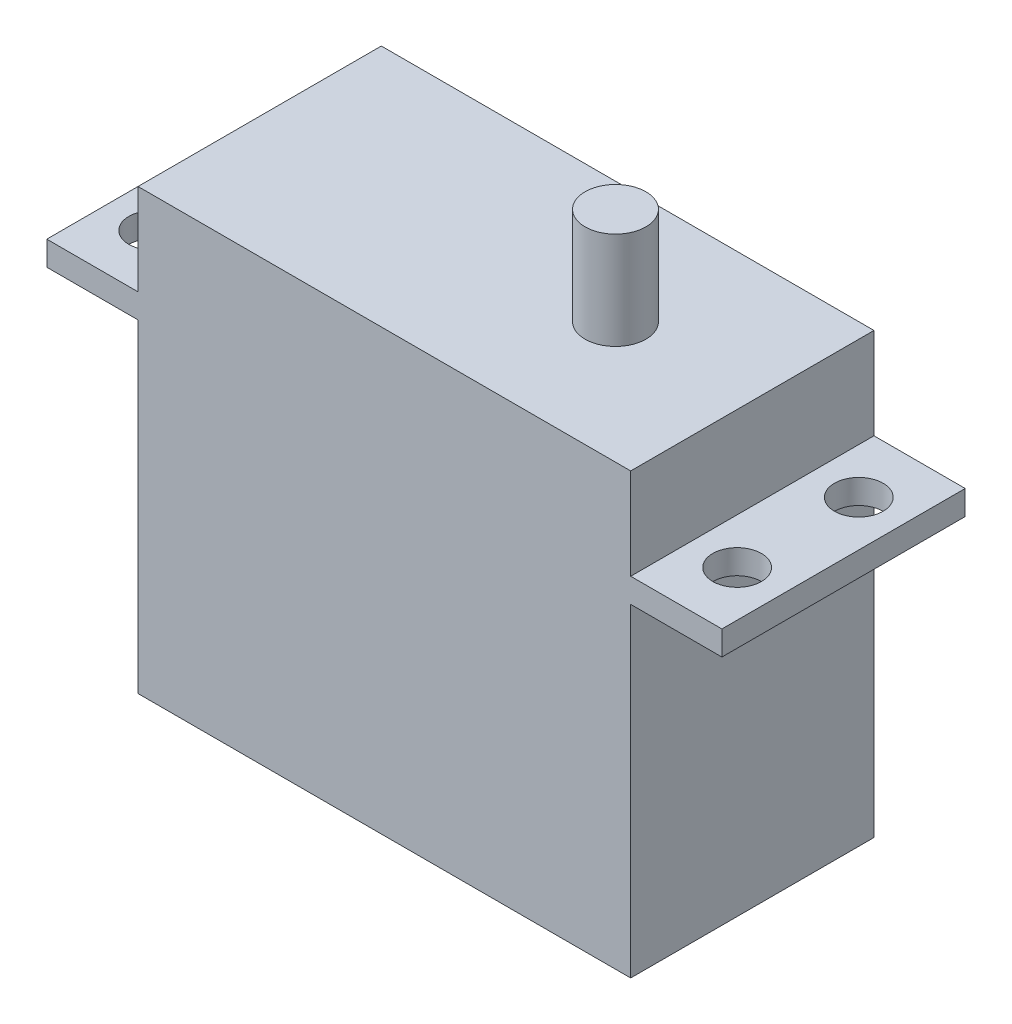
ISO-10303-21;
HEADER;
FILE_DESCRIPTION(('STEP AP214'),'2;1');
FILE_NAME('part.step','',(''),(''),'','','');
FILE_SCHEMA(('AUTOMOTIVE_DESIGN { 1 0 10303 214 1 1 1 1 }'));
ENDSEC;
DATA;
#1=APPLICATION_CONTEXT('core data for automotive mechanical design processes');
#2=APPLICATION_PROTOCOL_DEFINITION('international standard','automotive_design',2000,#1);
#3=PRODUCT_CONTEXT('',#1,'mechanical');
#4=PRODUCT('Part','Part','',(#3));
#5=PRODUCT_RELATED_PRODUCT_CATEGORY('part','',(#4));
#6=PRODUCT_DEFINITION_FORMATION('','',#4);
#7=PRODUCT_DEFINITION_CONTEXT('part definition',#1,'design');
#8=PRODUCT_DEFINITION('design','',#6,#7);
#9=PRODUCT_DEFINITION_SHAPE('','',#8);
#10=(LENGTH_UNIT() NAMED_UNIT(*) SI_UNIT(.MILLI.,.METRE.));
#11=(NAMED_UNIT(*) PLANE_ANGLE_UNIT() SI_UNIT($,.RADIAN.));
#12=(NAMED_UNIT(*) SI_UNIT($,.STERADIAN.) SOLID_ANGLE_UNIT());
#13=UNCERTAINTY_MEASURE_WITH_UNIT(LENGTH_MEASURE(1.E-05),#10,'distance_accuracy_value','');
#14=(GEOMETRIC_REPRESENTATION_CONTEXT(3) GLOBAL_UNCERTAINTY_ASSIGNED_CONTEXT((#13)) GLOBAL_UNIT_ASSIGNED_CONTEXT((#10,
#11,#12)) REPRESENTATION_CONTEXT('',''));
#15=CARTESIAN_POINT('',(0.,0.,0.));
#16=DIRECTION('',(0.,0.,1.));
#17=DIRECTION('',(1.,0.,0.));
#18=AXIS2_PLACEMENT_3D('',#15,#16,#17);
#19=CARTESIAN_POINT('',(-16.7432620080768,36.1,-10.7539016762014));
#20=DIRECTION('',(1.,0.,0.));
#21=DIRECTION('',(0.,0.,-1.));
#22=AXIS2_PLACEMENT_3D('',#19,#20,#21);
#23=PLANE('',#22);
#24=DIRECTION('',(0.,-1.,0.));
#25=VECTOR('',#24,1.);
#26=CARTESIAN_POINT('',(-16.7432620080768,36.1,-10.7539016762014));
#27=LINE('',#26,#25);
#28=CARTESIAN_POINT('',(-16.7432620080768,36.1,-10.7539016762014));
#29=VERTEX_POINT('',#28);
#30=CARTESIAN_POINT('',(-16.7432620080768,28.6,-10.7539016762014));
#31=VERTEX_POINT('',#30);
#32=EDGE_CURVE('E210',#29,#31,#27,.T.);
#33=ORIENTED_EDGE('',*,*,#32,.T.);
#34=DIRECTION('',(0.,0.,1.));
#35=VECTOR('',#34,1.);
#36=CARTESIAN_POINT('',(-16.7432620080768,28.6,-10.7539016762014));
#37=LINE('',#36,#35);
#38=CARTESIAN_POINT('',(-16.7432620080768,28.6,9.24609832379855));
#39=VERTEX_POINT('',#38);
#40=EDGE_CURVE('E181',#31,#39,#37,.T.);
#41=ORIENTED_EDGE('',*,*,#40,.T.);
#42=DIRECTION('',(0.,-1.,0.));
#43=VECTOR('',#42,1.);
#44=CARTESIAN_POINT('',(-16.7432620080768,36.1,9.24609832379855));
#45=LINE('',#44,#43);
#46=CARTESIAN_POINT('',(-16.7432620080768,36.1,9.24609832379855));
#47=VERTEX_POINT('',#46);
#48=EDGE_CURVE('E11',#47,#39,#45,.T.);
#49=ORIENTED_EDGE('',*,*,#48,.F.);
#50=DIRECTION('',(0.,0.,1.));
#51=VECTOR('',#50,1.);
#52=CARTESIAN_POINT('',(-16.7432620080768,36.1,-10.7539016762014));
#53=LINE('',#52,#51);
#54=EDGE_CURVE('E191',#29,#47,#53,.T.);
#55=ORIENTED_EDGE('',*,*,#54,.F.);
#56=EDGE_LOOP('',(#33,#41,#49,#55));
#57=FACE_BOUND('',#56,.T.);
#58=ADVANCED_FACE('F32',(#57),#23,.F.);
#59=CARTESIAN_POINT('',(23.7567379919232,36.1,-10.7539016762014));
#60=DIRECTION('',(-1.,0.,0.));
#61=DIRECTION('',(0.,0.,1.));
#62=AXIS2_PLACEMENT_3D('',#59,#60,#61);
#63=PLANE('',#62);
#64=DIRECTION('',(0.,-1.,0.));
#65=VECTOR('',#64,1.);
#66=CARTESIAN_POINT('',(23.7567379919232,36.1,9.24609832379855));
#67=LINE('',#66,#65);
#68=CARTESIAN_POINT('',(23.7567379919232,36.1,9.24609832379855));
#69=VERTEX_POINT('',#68);
#70=CARTESIAN_POINT('',(23.7567379919232,28.6,9.24609832379855));
#71=VERTEX_POINT('',#70);
#72=EDGE_CURVE('E218',#69,#71,#67,.T.);
#73=ORIENTED_EDGE('',*,*,#72,.T.);
#74=DIRECTION('',(0.,0.,-1.));
#75=VECTOR('',#74,1.);
#76=CARTESIAN_POINT('',(23.7567379919232,28.6,-10.7539016762014));
#77=LINE('',#76,#75);
#78=CARTESIAN_POINT('',(23.7567379919232,28.6,-10.7539016762015));
#79=VERTEX_POINT('',#78);
#80=EDGE_CURVE('E178',#71,#79,#77,.T.);
#81=ORIENTED_EDGE('',*,*,#80,.T.);
#82=DIRECTION('',(0.,-1.,0.));
#83=VECTOR('',#82,1.);
#84=CARTESIAN_POINT('',(23.7567379919232,36.1,-10.7539016762014));
#85=LINE('',#84,#83);
#86=CARTESIAN_POINT('',(23.7567379919232,36.1,-10.7539016762014));
#87=VERTEX_POINT('',#86);
#88=EDGE_CURVE('E214',#87,#79,#85,.T.);
#89=ORIENTED_EDGE('',*,*,#88,.F.);
#90=DIRECTION('',(0.,0.,-1.));
#91=VECTOR('',#90,1.);
#92=CARTESIAN_POINT('',(23.7567379919232,36.1,-10.7539016762014));
#93=LINE('',#92,#91);
#94=EDGE_CURVE('E197',#69,#87,#93,.T.);
#95=ORIENTED_EDGE('',*,*,#94,.F.);
#96=EDGE_LOOP('',(#73,#81,#89,#95));
#97=FACE_BOUND('',#96,.T.);
#98=ADVANCED_FACE('F246',(#97),#63,.F.);
#99=CARTESIAN_POINT('',(-16.7432620080768,26.6,9.24609832379855));
#100=VERTEX_POINT('',#99);
#101=CARTESIAN_POINT('',(-16.7432620080768,0.,9.24609832379855));
#102=VERTEX_POINT('',#101);
#103=EDGE_CURVE('E41',#100,#102,#45,.T.);
#104=ORIENTED_EDGE('',*,*,#103,.F.);
#105=DIRECTION('',(0.,0.,-1.));
#106=VECTOR('',#105,1.);
#107=CARTESIAN_POINT('',(-16.7432620080768,26.6,-10.7539016762014));
#108=LINE('',#107,#106);
#109=CARTESIAN_POINT('',(-16.7432620080768,26.6,-10.7539016762014));
#110=VERTEX_POINT('',#109);
#111=EDGE_CURVE('E176',#100,#110,#108,.T.);
#112=ORIENTED_EDGE('',*,*,#111,.T.);
#113=CARTESIAN_POINT('',(-16.7432620080768,0.,-10.7539016762014));
#114=VERTEX_POINT('',#113);
#115=EDGE_CURVE('E128',#110,#114,#27,.T.);
#116=ORIENTED_EDGE('',*,*,#115,.T.);
#117=DIRECTION('',(0.,0.,1.));
#118=VECTOR('',#117,1.);
#119=CARTESIAN_POINT('',(-16.7432620080768,0.,-10.7539016762014));
#120=LINE('',#119,#118);
#121=EDGE_CURVE('E188',#114,#102,#120,.T.);
#122=ORIENTED_EDGE('',*,*,#121,.T.);
#123=EDGE_LOOP('',(#104,#112,#116,#122));
#124=FACE_BOUND('',#123,.T.);
#125=ADVANCED_FACE('F34',(#124),#23,.F.);
#126=CARTESIAN_POINT('',(-16.7432620080768,36.1,9.24609832379855));
#127=DIRECTION('',(0.,0.,-1.));
#128=DIRECTION('',(-1.,0.,0.));
#129=AXIS2_PLACEMENT_3D('',#126,#127,#128);
#130=PLANE('',#129);
#131=CARTESIAN_POINT('',(23.7567379919232,26.6,9.24609832379855));
#132=VERTEX_POINT('',#131);
#133=CARTESIAN_POINT('',(23.7567379919232,0.,9.24609832379855));
#134=VERTEX_POINT('',#133);
#135=EDGE_CURVE('E217',#132,#134,#67,.T.);
#136=ORIENTED_EDGE('',*,*,#135,.F.);
#137=DIRECTION('',(-1.,0.,0.));
#138=VECTOR('',#137,1.);
#139=CARTESIAN_POINT('',(31.2567379919232,26.6,9.24609832379855));
#140=LINE('',#139,#138);
#141=CARTESIAN_POINT('',(31.2567379919232,26.6,9.24609832379855));
#142=VERTEX_POINT('',#141);
#143=EDGE_CURVE('E49',#142,#132,#140,.T.);
#144=ORIENTED_EDGE('',*,*,#143,.F.);
#145=DIRECTION('',(0.,1.,0.));
#146=VECTOR('',#145,1.);
#147=CARTESIAN_POINT('',(31.2567379919232,28.6,9.24609832379855));
#148=LINE('',#147,#146);
#149=CARTESIAN_POINT('',(31.2567379919232,28.6,9.24609832379855));
#150=VERTEX_POINT('',#149);
#151=EDGE_CURVE('E160',#142,#150,#148,.T.);
#152=ORIENTED_EDGE('',*,*,#151,.T.);
#153=DIRECTION('',(-1.,0.,0.));
#154=VECTOR('',#153,1.);
#155=CARTESIAN_POINT('',(31.2567379919232,28.6,9.24609832379855));
#156=LINE('',#155,#154);
#157=EDGE_CURVE('E169',#150,#71,#156,.T.);
#158=ORIENTED_EDGE('',*,*,#157,.T.);
#159=ORIENTED_EDGE('',*,*,#72,.F.);
#160=DIRECTION('',(1.,0.,0.));
#161=VECTOR('',#160,1.);
#162=CARTESIAN_POINT('',(-16.7432620080768,36.1,9.24609832379855));
#163=LINE('',#162,#161);
#164=EDGE_CURVE('E194',#47,#69,#163,.T.);
#165=ORIENTED_EDGE('',*,*,#164,.F.);
#166=ORIENTED_EDGE('',*,*,#48,.T.);
#167=CARTESIAN_POINT('',(-24.2432620080768,28.6,9.24609832379856));
#168=VERTEX_POINT('',#167);
#169=EDGE_CURVE('E172',#39,#168,#156,.T.);
#170=ORIENTED_EDGE('',*,*,#169,.T.);
#171=DIRECTION('',(0.,1.,0.));
#172=VECTOR('',#171,1.);
#173=CARTESIAN_POINT('',(-24.2432620080768,28.6,9.24609832379856));
#174=LINE('',#173,#172);
#175=CARTESIAN_POINT('',(-24.2432620080768,26.6,9.24609832379856));
#176=VERTEX_POINT('',#175);
#177=EDGE_CURVE('E140',#176,#168,#174,.T.);
#178=ORIENTED_EDGE('',*,*,#177,.F.);
#179=EDGE_CURVE('E136',#100,#176,#140,.T.);
#180=ORIENTED_EDGE('',*,*,#179,.F.);
#181=ORIENTED_EDGE('',*,*,#103,.T.);
#182=DIRECTION('',(1.,0.,0.));
#183=VECTOR('',#182,1.);
#184=CARTESIAN_POINT('',(-16.7432620080768,0.,9.24609832379855));
#185=LINE('',#184,#183);
#186=EDGE_CURVE('E203',#102,#134,#185,.T.);
#187=ORIENTED_EDGE('',*,*,#186,.T.);
#188=EDGE_LOOP('',(#136,#144,#152,#158,#159,#165,#166,#170,#178,#180,#181,#187));
#189=FACE_BOUND('',#188,.T.);
#190=ADVANCED_FACE('F231',(#189),#130,.F.);
#191=CARTESIAN_POINT('',(23.7567379919232,26.6,-10.7539016762015));
#192=VERTEX_POINT('',#191);
#193=CARTESIAN_POINT('',(23.7567379919232,0.,-10.7539016762014));
#194=VERTEX_POINT('',#193);
#195=EDGE_CURVE('E213',#192,#194,#85,.T.);
#196=ORIENTED_EDGE('',*,*,#195,.F.);
#197=DIRECTION('',(0.,0.,1.));
#198=VECTOR('',#197,1.);
#199=CARTESIAN_POINT('',(23.7567379919232,26.6,-10.7539016762014));
#200=LINE('',#199,#198);
#201=EDGE_CURVE('E167',#192,#132,#200,.T.);
#202=ORIENTED_EDGE('',*,*,#201,.T.);
#203=ORIENTED_EDGE('',*,*,#135,.T.);
#204=DIRECTION('',(0.,0.,-1.));
#205=VECTOR('',#204,1.);
#206=CARTESIAN_POINT('',(23.7567379919232,0.,-10.7539016762014));
#207=LINE('',#206,#205);
#208=EDGE_CURVE('E206',#134,#194,#207,.T.);
#209=ORIENTED_EDGE('',*,*,#208,.T.);
#210=EDGE_LOOP('',(#196,#202,#203,#209));
#211=FACE_BOUND('',#210,.T.);
#212=ADVANCED_FACE('F226',(#211),#63,.F.);
#213=CARTESIAN_POINT('',(-16.7432620080768,36.1,-10.7539016762014));
#214=DIRECTION('',(0.,0.,1.));
#215=DIRECTION('',(1.,0.,0.));
#216=AXIS2_PLACEMENT_3D('',#213,#214,#215);
#217=PLANE('',#216);
#218=ORIENTED_EDGE('',*,*,#115,.F.);
#219=DIRECTION('',(-1.,0.,0.));
#220=VECTOR('',#219,1.);
#221=CARTESIAN_POINT('',(31.2567379919232,26.6,-10.7539016762015));
#222=LINE('',#221,#220);
#223=CARTESIAN_POINT('',(-24.2432620080768,26.6,-10.7539016762014));
#224=VERTEX_POINT('',#223);
#225=EDGE_CURVE('E57',#110,#224,#222,.T.);
#226=ORIENTED_EDGE('',*,*,#225,.T.);
#227=DIRECTION('',(0.,-1.,0.));
#228=VECTOR('',#227,1.);
#229=CARTESIAN_POINT('',(-24.2432620080768,28.6,-10.7539016762014));
#230=LINE('',#229,#228);
#231=CARTESIAN_POINT('',(-24.2432620080768,28.6,-10.7539016762014));
#232=VERTEX_POINT('',#231);
#233=EDGE_CURVE('E126',#232,#224,#230,.T.);
#234=ORIENTED_EDGE('',*,*,#233,.F.);
#235=DIRECTION('',(-1.,0.,0.));
#236=VECTOR('',#235,1.);
#237=CARTESIAN_POINT('',(31.2567379919232,28.6,-10.7539016762015));
#238=LINE('',#237,#236);
#239=EDGE_CURVE('E168',#31,#232,#238,.T.);
#240=ORIENTED_EDGE('',*,*,#239,.F.);
#241=ORIENTED_EDGE('',*,*,#32,.F.);
#242=DIRECTION('',(-1.,0.,0.));
#243=VECTOR('',#242,1.);
#244=CARTESIAN_POINT('',(-16.7432620080768,36.1,-10.7539016762014));
#245=LINE('',#244,#243);
#246=EDGE_CURVE('E199',#87,#29,#245,.T.);
#247=ORIENTED_EDGE('',*,*,#246,.F.);
#248=ORIENTED_EDGE('',*,*,#88,.T.);
#249=CARTESIAN_POINT('',(31.2567379919232,28.6,-10.7539016762015));
#250=VERTEX_POINT('',#249);
#251=EDGE_CURVE('E165',#250,#79,#238,.T.);
#252=ORIENTED_EDGE('',*,*,#251,.F.);
#253=DIRECTION('',(0.,-1.,0.));
#254=VECTOR('',#253,1.);
#255=CARTESIAN_POINT('',(31.2567379919232,28.6,-10.7539016762015));
#256=LINE('',#255,#254);
#257=CARTESIAN_POINT('',(31.2567379919232,26.6,-10.7539016762015));
#258=VERTEX_POINT('',#257);
#259=EDGE_CURVE('E155',#250,#258,#256,.T.);
#260=ORIENTED_EDGE('',*,*,#259,.T.);
#261=EDGE_CURVE('E129',#258,#192,#222,.T.);
#262=ORIENTED_EDGE('',*,*,#261,.T.);
#263=ORIENTED_EDGE('',*,*,#195,.T.);
#264=DIRECTION('',(-1.,0.,0.));
#265=VECTOR('',#264,1.);
#266=CARTESIAN_POINT('',(-16.7432620080768,0.,-10.7539016762014));
#267=LINE('',#266,#265);
#268=EDGE_CURVE('E195',#194,#114,#267,.T.);
#269=ORIENTED_EDGE('',*,*,#268,.T.);
#270=EDGE_LOOP('',(#218,#226,#234,#240,#241,#247,#248,#252,#260,#262,#263,#269));
#271=FACE_BOUND('',#270,.T.);
#272=ADVANCED_FACE('F123',(#271),#217,.F.);
#273=CARTESIAN_POINT('',(0.,36.1,0.));
#274=DIRECTION('',(0.,1.,0.));
#275=DIRECTION('',(0.,0.,1.));
#276=AXIS2_PLACEMENT_3D('',#273,#274,#275);
#277=PLANE('',#276);
#278=CARTESIAN_POINT('',(12.5067379919232,36.1,-0.753901676201447));
#279=DIRECTION('',(0.,1.,0.));
#280=DIRECTION('',(0.,0.,1.));
#281=AXIS2_PLACEMENT_3D('',#278,#279,#280);
#282=CIRCLE('',#281,2.5);
#283=CARTESIAN_POINT('',(12.5067379919232,36.1,1.74609832379855));
#284=VERTEX_POINT('',#283);
#285=EDGE_CURVE('E184',#284,#284,#282,.T.);
#286=ORIENTED_EDGE('',*,*,#285,.F.);
#287=EDGE_LOOP('',(#286));
#288=FACE_BOUND('',#287,.T.);
#289=ORIENTED_EDGE('',*,*,#54,.T.);
#290=ORIENTED_EDGE('',*,*,#164,.T.);
#291=ORIENTED_EDGE('',*,*,#94,.T.);
#292=ORIENTED_EDGE('',*,*,#246,.T.);
#293=EDGE_LOOP('',(#289,#290,#291,#292));
#294=FACE_BOUND('',#293,.T.);
#295=ADVANCED_FACE('F251',(#288,#294),#277,.T.);
#296=CARTESIAN_POINT('',(0.,0.,0.));
#297=DIRECTION('',(0.,1.,0.));
#298=DIRECTION('',(0.,0.,1.));
#299=AXIS2_PLACEMENT_3D('',#296,#297,#298);
#300=PLANE('',#299);
#301=ORIENTED_EDGE('',*,*,#121,.F.);
#302=ORIENTED_EDGE('',*,*,#268,.F.);
#303=ORIENTED_EDGE('',*,*,#208,.F.);
#304=ORIENTED_EDGE('',*,*,#186,.F.);
#305=EDGE_LOOP('',(#301,#302,#303,#304));
#306=FACE_BOUND('',#305,.T.);
#307=ADVANCED_FACE('F235',(#306),#300,.F.);
#308=CARTESIAN_POINT('',(12.5067379919232,44.1,-0.753901676201447));
#309=DIRECTION('',(0.,-1.,0.));
#310=DIRECTION('',(0.,0.,-1.));
#311=AXIS2_PLACEMENT_3D('',#308,#309,#310);
#312=CYLINDRICAL_SURFACE('',#311,2.5);
#313=CARTESIAN_POINT('',(12.5067379919232,44.1,-0.753901676201447));
#314=DIRECTION('',(0.,1.,0.));
#315=DIRECTION('',(0.,0.,1.));
#316=AXIS2_PLACEMENT_3D('',#313,#314,#315);
#317=CIRCLE('',#316,2.5);
#318=CARTESIAN_POINT('',(12.5067379919232,44.1,1.74609832379855));
#319=VERTEX_POINT('',#318);
#320=EDGE_CURVE('E185',#319,#319,#317,.T.);
#321=ORIENTED_EDGE('',*,*,#320,.F.);
#322=EDGE_LOOP('',(#321));
#323=FACE_BOUND('',#322,.T.);
#324=ORIENTED_EDGE('',*,*,#285,.T.);
#325=EDGE_LOOP('',(#324));
#326=FACE_BOUND('',#325,.T.);
#327=ADVANCED_FACE('F287',(#323,#326),#312,.T.);
#328=CARTESIAN_POINT('',(12.5067379919232,44.1,-0.753901676201447));
#329=DIRECTION('',(0.,1.,0.));
#330=DIRECTION('',(0.,0.,1.));
#331=AXIS2_PLACEMENT_3D('',#328,#329,#330);
#332=PLANE('',#331);
#333=ORIENTED_EDGE('',*,*,#320,.T.);
#334=EDGE_LOOP('',(#333));
#335=FACE_BOUND('',#334,.T.);
#336=ADVANCED_FACE('F293',(#335),#332,.T.);
#337=CARTESIAN_POINT('',(31.2567379919232,0.,0.));
#338=DIRECTION('',(-1.,0.,0.));
#339=DIRECTION('',(0.,0.,1.));
#340=AXIS2_PLACEMENT_3D('',#337,#338,#339);
#341=PLANE('',#340);
#342=ORIENTED_EDGE('',*,*,#259,.F.);
#343=DIRECTION('',(0.,0.,-1.));
#344=VECTOR('',#343,1.);
#345=CARTESIAN_POINT('',(31.2567379919232,28.6,-10.7539016762015));
#346=LINE('',#345,#344);
#347=EDGE_CURVE('E130',#150,#250,#346,.T.);
#348=ORIENTED_EDGE('',*,*,#347,.F.);
#349=ORIENTED_EDGE('',*,*,#151,.F.);
#350=DIRECTION('',(0.,0.,1.));
#351=VECTOR('',#350,1.);
#352=CARTESIAN_POINT('',(31.2567379919232,26.6,-10.7539016762015));
#353=LINE('',#352,#351);
#354=EDGE_CURVE('E158',#258,#142,#353,.T.);
#355=ORIENTED_EDGE('',*,*,#354,.F.);
#356=EDGE_LOOP('',(#342,#348,#349,#355));
#357=FACE_BOUND('',#356,.T.);
#358=ADVANCED_FACE('F241',(#357),#341,.F.);
#359=CARTESIAN_POINT('',(31.2567379919232,26.6,-10.7539016762015));
#360=DIRECTION('',(0.,-1.,0.));
#361=DIRECTION('',(0.,0.,-1.));
#362=AXIS2_PLACEMENT_3D('',#359,#360,#361);
#363=PLANE('',#362);
#364=CARTESIAN_POINT('',(27.5067379919232,26.6,4.24609832379854));
#365=DIRECTION('',(0.,-1.,0.));
#366=DIRECTION('',(0.,0.,-1.));
#367=AXIS2_PLACEMENT_3D('',#364,#365,#366);
#368=CIRCLE('',#367,2.);
#369=CARTESIAN_POINT('',(27.5067379919232,26.6,2.24609832379854));
#370=VERTEX_POINT('',#369);
#371=EDGE_CURVE('E330',#370,#370,#368,.T.);
#372=ORIENTED_EDGE('',*,*,#371,.F.);
#373=EDGE_LOOP('',(#372));
#374=FACE_BOUND('',#373,.T.);
#375=CARTESIAN_POINT('',(27.5067379919232,26.6,-5.75390167620146));
#376=DIRECTION('',(0.,-1.,0.));
#377=DIRECTION('',(0.,0.,-1.));
#378=AXIS2_PLACEMENT_3D('',#375,#376,#377);
#379=CIRCLE('',#378,2.);
#380=CARTESIAN_POINT('',(27.5067379919232,26.6,-7.75390167620146));
#381=VERTEX_POINT('',#380);
#382=EDGE_CURVE('E342',#381,#381,#379,.T.);
#383=ORIENTED_EDGE('',*,*,#382,.F.);
#384=EDGE_LOOP('',(#383));
#385=FACE_BOUND('',#384,.T.);
#386=ORIENTED_EDGE('',*,*,#201,.F.);
#387=ORIENTED_EDGE('',*,*,#261,.F.);
#388=ORIENTED_EDGE('',*,*,#354,.T.);
#389=ORIENTED_EDGE('',*,*,#143,.T.);
#390=EDGE_LOOP('',(#386,#387,#388,#389));
#391=FACE_BOUND('',#390,.T.);
#392=ADVANCED_FACE('F238',(#374,#385,#391),#363,.T.);
#393=CARTESIAN_POINT('',(31.2567379919232,28.6,-10.7539016762015));
#394=DIRECTION('',(0.,1.,0.));
#395=DIRECTION('',(0.,0.,1.));
#396=AXIS2_PLACEMENT_3D('',#393,#394,#395);
#397=PLANE('',#396);
#398=CARTESIAN_POINT('',(27.5067379919232,28.6,4.24609832379854));
#399=DIRECTION('',(0.,1.,0.));
#400=DIRECTION('',(0.,0.,1.));
#401=AXIS2_PLACEMENT_3D('',#398,#399,#400);
#402=CIRCLE('',#401,2.);
#403=CARTESIAN_POINT('',(27.5067379919232,28.6,6.24609832379855));
#404=VERTEX_POINT('',#403);
#405=EDGE_CURVE('E333',#404,#404,#402,.T.);
#406=ORIENTED_EDGE('',*,*,#405,.F.);
#407=EDGE_LOOP('',(#406));
#408=FACE_BOUND('',#407,.T.);
#409=CARTESIAN_POINT('',(27.5067379919232,28.6,-5.75390167620146));
#410=DIRECTION('',(0.,1.,0.));
#411=DIRECTION('',(0.,0.,1.));
#412=AXIS2_PLACEMENT_3D('',#409,#410,#411);
#413=CIRCLE('',#412,2.);
#414=CARTESIAN_POINT('',(27.5067379919232,28.6,-3.75390167620145));
#415=VERTEX_POINT('',#414);
#416=EDGE_CURVE('E340',#415,#415,#413,.T.);
#417=ORIENTED_EDGE('',*,*,#416,.F.);
#418=EDGE_LOOP('',(#417));
#419=FACE_BOUND('',#418,.T.);
#420=ORIENTED_EDGE('',*,*,#80,.F.);
#421=ORIENTED_EDGE('',*,*,#157,.F.);
#422=ORIENTED_EDGE('',*,*,#347,.T.);
#423=ORIENTED_EDGE('',*,*,#251,.T.);
#424=EDGE_LOOP('',(#420,#421,#422,#423));
#425=FACE_BOUND('',#424,.T.);
#426=ADVANCED_FACE('F244',(#408,#419,#425),#397,.T.);
#427=CARTESIAN_POINT('',(-20.4932620080768,28.6,4.24609832379855));
#428=DIRECTION('',(0.,1.,0.));
#429=DIRECTION('',(0.,0.,1.));
#430=AXIS2_PLACEMENT_3D('',#427,#428,#429);
#431=CIRCLE('',#430,2.);
#432=CARTESIAN_POINT('',(-20.4932620080768,28.6,6.24609832379856));
#433=VERTEX_POINT('',#432);
#434=EDGE_CURVE('E335',#433,#433,#431,.T.);
#435=ORIENTED_EDGE('',*,*,#434,.F.);
#436=EDGE_LOOP('',(#435));
#437=FACE_BOUND('',#436,.T.);
#438=CARTESIAN_POINT('',(-20.4932620080768,28.6,-5.75390167620145));
#439=DIRECTION('',(0.,1.,0.));
#440=DIRECTION('',(0.,0.,1.));
#441=AXIS2_PLACEMENT_3D('',#438,#439,#440);
#442=CIRCLE('',#441,2.);
#443=CARTESIAN_POINT('',(-20.4932620080768,28.6,-3.75390167620144));
#444=VERTEX_POINT('',#443);
#445=EDGE_CURVE('E149',#444,#444,#442,.T.);
#446=ORIENTED_EDGE('',*,*,#445,.F.);
#447=EDGE_LOOP('',(#446));
#448=FACE_BOUND('',#447,.T.);
#449=ORIENTED_EDGE('',*,*,#40,.F.);
#450=ORIENTED_EDGE('',*,*,#239,.T.);
#451=DIRECTION('',(0.,0.,-1.));
#452=VECTOR('',#451,1.);
#453=CARTESIAN_POINT('',(-24.2432620080768,28.6,-10.7539016762014));
#454=LINE('',#453,#452);
#455=EDGE_CURVE('E145',#168,#232,#454,.T.);
#456=ORIENTED_EDGE('',*,*,#455,.F.);
#457=ORIENTED_EDGE('',*,*,#169,.F.);
#458=EDGE_LOOP('',(#449,#450,#456,#457));
#459=FACE_BOUND('',#458,.T.);
#460=ADVANCED_FACE('F255',(#437,#448,#459),#397,.T.);
#461=CARTESIAN_POINT('',(-20.4932620080768,26.6,4.24609832379855));
#462=DIRECTION('',(0.,-1.,0.));
#463=DIRECTION('',(0.,0.,-1.));
#464=AXIS2_PLACEMENT_3D('',#461,#462,#463);
#465=CIRCLE('',#464,2.);
#466=CARTESIAN_POINT('',(-20.4932620080768,26.6,2.24609832379855));
#467=VERTEX_POINT('',#466);
#468=EDGE_CURVE('E36',#467,#467,#465,.T.);
#469=ORIENTED_EDGE('',*,*,#468,.F.);
#470=EDGE_LOOP('',(#469));
#471=FACE_BOUND('',#470,.T.);
#472=CARTESIAN_POINT('',(-20.4932620080768,26.6,-5.75390167620145));
#473=DIRECTION('',(0.,-1.,0.));
#474=DIRECTION('',(0.,0.,-1.));
#475=AXIS2_PLACEMENT_3D('',#472,#473,#474);
#476=CIRCLE('',#475,2.);
#477=CARTESIAN_POINT('',(-20.4932620080768,26.6,-7.75390167620145));
#478=VERTEX_POINT('',#477);
#479=EDGE_CURVE('E146',#478,#478,#476,.T.);
#480=ORIENTED_EDGE('',*,*,#479,.F.);
#481=EDGE_LOOP('',(#480));
#482=FACE_BOUND('',#481,.T.);
#483=ORIENTED_EDGE('',*,*,#111,.F.);
#484=ORIENTED_EDGE('',*,*,#179,.T.);
#485=DIRECTION('',(0.,0.,1.));
#486=VECTOR('',#485,1.);
#487=CARTESIAN_POINT('',(-24.2432620080768,26.6,-10.7539016762014));
#488=LINE('',#487,#486);
#489=EDGE_CURVE('E133',#224,#176,#488,.T.);
#490=ORIENTED_EDGE('',*,*,#489,.F.);
#491=ORIENTED_EDGE('',*,*,#225,.F.);
#492=EDGE_LOOP('',(#483,#484,#490,#491));
#493=FACE_BOUND('',#492,.T.);
#494=ADVANCED_FACE('F134',(#471,#482,#493),#363,.T.);
#495=CARTESIAN_POINT('',(-24.2432620080768,0.,0.));
#496=DIRECTION('',(-1.,0.,0.));
#497=DIRECTION('',(0.,0.,1.));
#498=AXIS2_PLACEMENT_3D('',#495,#496,#497);
#499=PLANE('',#498);
#500=ORIENTED_EDGE('',*,*,#233,.T.);
#501=ORIENTED_EDGE('',*,*,#489,.T.);
#502=ORIENTED_EDGE('',*,*,#177,.T.);
#503=ORIENTED_EDGE('',*,*,#455,.T.);
#504=EDGE_LOOP('',(#500,#501,#502,#503));
#505=FACE_BOUND('',#504,.T.);
#506=ADVANCED_FACE('F143',(#505),#499,.T.);
#507=CARTESIAN_POINT('',(-20.4932620080768,21.1,-5.75390167620145));
#508=DIRECTION('',(0.,1.,0.));
#509=DIRECTION('',(0.,0.,1.));
#510=AXIS2_PLACEMENT_3D('',#507,#508,#509);
#511=CYLINDRICAL_SURFACE('',#510,2.);
#512=ORIENTED_EDGE('',*,*,#479,.T.);
#513=EDGE_LOOP('',(#512));
#514=FACE_BOUND('',#513,.T.);
#515=ORIENTED_EDGE('',*,*,#445,.T.);
#516=EDGE_LOOP('',(#515));
#517=FACE_BOUND('',#516,.T.);
#518=ADVANCED_FACE('F310',(#514,#517),#511,.F.);
#519=CARTESIAN_POINT('',(27.5067379919232,21.1,-5.75390167620146));
#520=DIRECTION('',(0.,1.,0.));
#521=DIRECTION('',(0.,0.,1.));
#522=AXIS2_PLACEMENT_3D('',#519,#520,#521);
#523=CYLINDRICAL_SURFACE('',#522,2.);
#524=ORIENTED_EDGE('',*,*,#382,.T.);
#525=EDGE_LOOP('',(#524));
#526=FACE_BOUND('',#525,.T.);
#527=ORIENTED_EDGE('',*,*,#416,.T.);
#528=EDGE_LOOP('',(#527));
#529=FACE_BOUND('',#528,.T.);
#530=ADVANCED_FACE('F313',(#526,#529),#523,.F.);
#531=CARTESIAN_POINT('',(-20.4932620080768,21.1,4.24609832379855));
#532=DIRECTION('',(0.,1.,0.));
#533=DIRECTION('',(0.,0.,1.));
#534=AXIS2_PLACEMENT_3D('',#531,#532,#533);
#535=CYLINDRICAL_SURFACE('',#534,2.);
#536=ORIENTED_EDGE('',*,*,#468,.T.);
#537=EDGE_LOOP('',(#536));
#538=FACE_BOUND('',#537,.T.);
#539=ORIENTED_EDGE('',*,*,#434,.T.);
#540=EDGE_LOOP('',(#539));
#541=FACE_BOUND('',#540,.T.);
#542=ADVANCED_FACE('F317',(#538,#541),#535,.F.);
#543=CARTESIAN_POINT('',(27.5067379919232,21.1,4.24609832379854));
#544=DIRECTION('',(0.,1.,0.));
#545=DIRECTION('',(0.,0.,1.));
#546=AXIS2_PLACEMENT_3D('',#543,#544,#545);
#547=CYLINDRICAL_SURFACE('',#546,2.);
#548=ORIENTED_EDGE('',*,*,#371,.T.);
#549=EDGE_LOOP('',(#548));
#550=FACE_BOUND('',#549,.T.);
#551=ORIENTED_EDGE('',*,*,#405,.T.);
#552=EDGE_LOOP('',(#551));
#553=FACE_BOUND('',#552,.T.);
#554=ADVANCED_FACE('F321',(#550,#553),#547,.F.);
#555=CLOSED_SHELL('',(#58,#98,#125,#190,#212,#272,#295,#307,#327,#336,#358,#392,#426,#460,#494,
#506,#518,#530,#542,#554));
#556=MANIFOLD_SOLID_BREP('B2',#555);
#557=ADVANCED_BREP_SHAPE_REPRESENTATION('',(#18,#556),#14);
#558=SHAPE_DEFINITION_REPRESENTATION(#9,#557);
ENDSEC;
END-ISO-10303-21;
